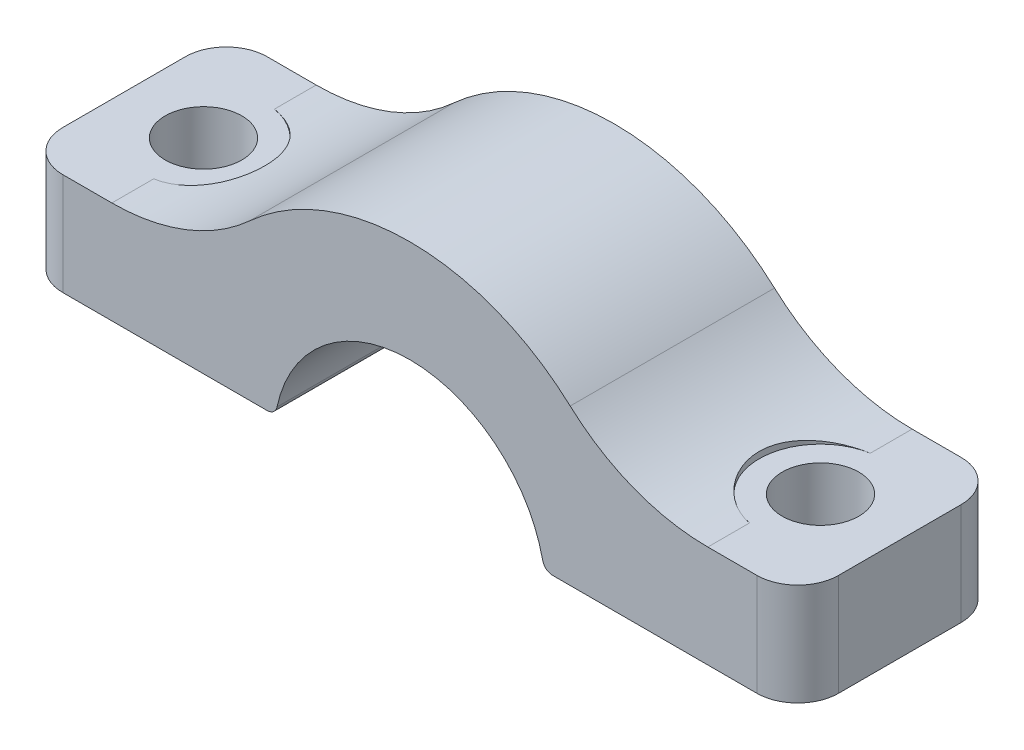
ISO-10303-21;
HEADER;
FILE_DESCRIPTION(('STEP AP214'),'2;1');
FILE_NAME('part.step','',(''),(''),'','','');
FILE_SCHEMA(('AUTOMOTIVE_DESIGN { 1 0 10303 214 1 1 1 1 }'));
ENDSEC;
DATA;
#1=APPLICATION_CONTEXT('core data for automotive mechanical design processes');
#2=APPLICATION_PROTOCOL_DEFINITION('international standard','automotive_design',2000,#1);
#3=PRODUCT_CONTEXT('',#1,'mechanical');
#4=PRODUCT('Part','Part','',(#3));
#5=PRODUCT_RELATED_PRODUCT_CATEGORY('part','',(#4));
#6=PRODUCT_DEFINITION_FORMATION('','',#4);
#7=PRODUCT_DEFINITION_CONTEXT('part definition',#1,'design');
#8=PRODUCT_DEFINITION('design','',#6,#7);
#9=PRODUCT_DEFINITION_SHAPE('','',#8);
#10=(LENGTH_UNIT() NAMED_UNIT(*) SI_UNIT(.MILLI.,.METRE.));
#11=(NAMED_UNIT(*) PLANE_ANGLE_UNIT() SI_UNIT($,.RADIAN.));
#12=(NAMED_UNIT(*) SI_UNIT($,.STERADIAN.) SOLID_ANGLE_UNIT());
#13=UNCERTAINTY_MEASURE_WITH_UNIT(LENGTH_MEASURE(1.E-05),#10,'distance_accuracy_value','');
#14=(GEOMETRIC_REPRESENTATION_CONTEXT(3) GLOBAL_UNCERTAINTY_ASSIGNED_CONTEXT((#13)) GLOBAL_UNIT_ASSIGNED_CONTEXT((#10,
#11,#12)) REPRESENTATION_CONTEXT('',''));
#15=CARTESIAN_POINT('',(0.,0.,0.));
#16=DIRECTION('',(0.,0.,1.));
#17=DIRECTION('',(1.,0.,0.));
#18=AXIS2_PLACEMENT_3D('',#15,#16,#17);
#19=CARTESIAN_POINT('',(14.585009427491,16.,10.));
#20=DIRECTION('',(0.,0.,-1.));
#21=DIRECTION('',(-1.,0.,0.));
#22=AXIS2_PLACEMENT_3D('',#19,#20,#21);
#23=CYLINDRICAL_SURFACE('',#22,10.);
#24=CARTESIAN_POINT('',(15.1,6.01326956856115,2.));
#25=CARTESIAN_POINT('',(14.9367661269146,6.00485250927544,2.00000087654459));
#26=CARTESIAN_POINT('',(14.7733130198023,6.00047314089498,2.01336498374644));
#27=CARTESIAN_POINT('',(14.4507340623399,5.99959983526748,2.06654076836193));
#28=CARTESIAN_POINT('',(14.2916088451906,6.0031070456679,2.10635629436694));
#29=CARTESIAN_POINT('',(13.9824039622912,6.01697370667861,2.21116419828854));
#30=CARTESIAN_POINT('',(13.8323151209738,6.02732607414875,2.27613052222466));
#31=CARTESIAN_POINT('',(13.5449995272484,6.05318066823682,2.42930175150398));
#32=CARTESIAN_POINT('',(13.4077745884691,6.06868361961851,2.51750992695973));
#33=CARTESIAN_POINT('',(13.1471274756397,6.10302418485625,2.71664587051002));
#34=CARTESIAN_POINT('',(13.0240242341483,6.12192058685345,2.82798070914123));
#35=CARTESIAN_POINT('',(12.7978456634663,6.16032349186018,3.06934006760822));
#36=CARTESIAN_POINT('',(12.6947734102481,6.17983008803845,3.19936745255918));
#37=CARTESIAN_POINT('',(12.5089912368211,6.21739371442309,3.4783367193665));
#38=CARTESIAN_POINT('',(12.4268659945818,6.23540124765545,3.62767561032553));
#39=CARTESIAN_POINT('',(12.2889318432733,6.26690875682487,3.938494763909));
#40=CARTESIAN_POINT('',(12.2331195892255,6.28040930563832,4.09997348025818));
#41=CARTESIAN_POINT('',(12.1502306670392,6.30084193053895,4.42809180125496));
#42=CARTESIAN_POINT('',(12.1227543096182,6.30786521684924,4.59462451830534));
#43=CARTESIAN_POINT('',(12.0961013815823,6.31467407950614,4.93007267217022));
#44=CARTESIAN_POINT('',(12.0969198300451,6.31446092973069,5.09898768438028));
#45=CARTESIAN_POINT('',(12.1264208127996,6.30693293318789,5.42974810288126));
#46=CARTESIAN_POINT('',(12.1543784564872,6.29980284177822,5.59166314029092));
#47=CARTESIAN_POINT('',(12.2361709364483,6.27967523634557,5.90843140509762));
#48=CARTESIAN_POINT('',(12.2900078653457,6.26667724784396,6.06328406031478));
#49=CARTESIAN_POINT('',(12.4225473808099,6.23637380885285,6.36322629164774));
#50=CARTESIAN_POINT('',(12.5014774622686,6.21902926973003,6.50821120050457));
#51=CARTESIAN_POINT('',(12.6818575561403,6.1823393498464,6.78315211368967));
#52=CARTESIAN_POINT('',(12.7833117431742,6.16299359853608,6.9131053252411));
#53=CARTESIAN_POINT('',(13.0093048544914,6.12423991542917,7.15813437709802));
#54=CARTESIAN_POINT('',(13.1344143619797,6.1048456309043,7.27268698098064));
#55=CARTESIAN_POINT('',(13.4024260023923,6.06925285003561,7.47928750170722));
#56=CARTESIAN_POINT('',(13.545327768877,6.05305428789221,7.57133588192012));
#57=CARTESIAN_POINT('',(13.8445651977366,6.02632443038393,7.72991857478263));
#58=CARTESIAN_POINT('',(14.0008556092624,6.01577485602301,7.79653497689334));
#59=CARTESIAN_POINT('',(14.3227201658627,6.00214481829379,7.9025028486271));
#60=CARTESIAN_POINT('',(14.4882918959838,5.99906242114751,7.94186137534753));
#61=CARTESIAN_POINT('',(14.8180866107259,6.00140167737486,7.99122142771891));
#62=CARTESIAN_POINT('',(14.982173315723,6.00654563770945,8.00215021431764));
#63=CARTESIAN_POINT('',(15.3094653969658,6.02492990765717,7.99714994043213));
#64=CARTESIAN_POINT('',(15.4726708259121,6.03816972760323,7.98122250420763));
#65=CARTESIAN_POINT('',(15.7919054823002,6.07181188718119,7.92357892272608));
#66=CARTESIAN_POINT('',(15.9479913422934,6.0921389855716,7.88213031106569));
#67=CARTESIAN_POINT('',(16.2507698081613,6.1385231368307,7.77516178570986));
#68=CARTESIAN_POINT('',(16.3974607704527,6.16458118878035,7.70963767357888));
#69=CARTESIAN_POINT('',(16.6828374846286,6.22139984005256,7.55381294499273));
#70=CARTESIAN_POINT('',(16.821072897982,6.25229159110764,7.46273602117571));
#71=CARTESIAN_POINT('',(17.080570692444,6.31547417342827,7.2593222946712));
#72=CARTESIAN_POINT('',(17.2018279624693,6.34776542218256,7.14697911384667));
#73=CARTESIAN_POINT('',(17.4287547501869,6.41211338496221,6.89900362869404));
#74=CARTESIAN_POINT('',(17.5336457534418,6.44411335275764,6.76264200580975));
#75=CARTESIAN_POINT('',(17.7189825282921,6.50327888460009,6.47324233219243));
#76=CARTESIAN_POINT('',(17.7994307320783,6.53044492953706,6.32020594274911));
#77=CARTESIAN_POINT('',(17.9320744834349,6.5765167494182,6.00411293437004));
#78=CARTESIAN_POINT('',(17.9847070825921,6.59554934692606,5.84125908140043));
#79=CARTESIAN_POINT('',(18.0615753114739,6.62368922808501,5.50817865340546));
#80=CARTESIAN_POINT('',(18.0858249055792,6.63280139241476,5.33795574672504));
#81=CARTESIAN_POINT('',(18.1043375617697,6.639743207317,5.00563008947493));
#82=CARTESIAN_POINT('',(18.1002630949471,6.63819840710948,4.84363107092403));
#83=CARTESIAN_POINT('',(18.0661907231786,6.62547597106318,4.52278480955927));
#84=CARTESIAN_POINT('',(18.0361940634744,6.61429879794122,4.36393741572367));
#85=CARTESIAN_POINT('',(17.9521326792553,6.58382153312819,4.05641710712524));
#86=CARTESIAN_POINT('',(17.8984672030347,6.56465646530946,3.90762075845107));
#87=CARTESIAN_POINT('',(17.7689319616492,6.52016314650259,3.62103418664591));
#88=CARTESIAN_POINT('',(17.6930572438296,6.4948335210324,3.48324642716091));
#89=CARTESIAN_POINT('',(17.5170084823166,6.43902238325403,3.21534490532022));
#90=CARTESIAN_POINT('',(17.4158329626556,6.40835035785096,3.08592922702766));
#91=CARTESIAN_POINT('',(17.1939506514231,6.34563812404769,2.84543359495513));
#92=CARTESIAN_POINT('',(17.0732371995063,6.31359745183669,2.73435992001505));
#93=CARTESIAN_POINT('',(16.8091253587159,6.24948273747569,2.5285246961349));
#94=CARTESIAN_POINT('',(16.6649371011506,6.21747541070739,2.43475265038361));
#95=CARTESIAN_POINT('',(16.3619576380787,6.15793520622467,2.27292591679266));
#96=CARTESIAN_POINT('',(16.2031713510765,6.13040083003093,2.20486260612389));
#97=CARTESIAN_POINT('',(15.8887167939138,6.0841787669958,2.10119708225808));
#98=CARTESIAN_POINT('',(15.7338495720015,6.06495287552263,2.06340094358118));
#99=CARTESIAN_POINT('',(15.4193907655109,6.033619221808,2.01280526636627));
#100=CARTESIAN_POINT('',(15.2598004369312,6.02150958471777,1.99999914189252));
#101=CARTESIAN_POINT('',(15.1,6.01326956856115,2.));
#102=B_SPLINE_CURVE_WITH_KNOTS('',3,(#24,#25,#26,#27,#28,#29,#30,#31,#32,#33,#34,#35,#36,#37,
#38,#39,#40,#41,#42,#43,#44,#45,#46,#47,#48,#49,#50,#51,#52,#53,#54,#55,#56,#57,#58,#59,#60,#61,
#62,#63,#64,#65,#66,#67,#68,#69,#70,#71,#72,#73,#74,#75,#76,#77,#78,#79,#80,#81,#82,#83,#84,#85,
#86,#87,#88,#89,#90,#91,#92,#93,#94,#95,#96,#97,#98,#99,#100,#101),.UNSPECIFIED.,.T.,.F.,(4,2,2,
2,2,2,2,2,2,2,2,2,2,2,2,2,2,2,2,2,2,2,2,2,2,2,2,2,2,2,2,2,2,2,2,2,2,2,4),(0.,0.48977623754343,
0.979623751472693,1.46896517911544,1.95837549355997,2.45726790341088,2.95623686309255,
3.46789866781725,3.97949541115228,4.48377286280824,4.98796154361287,5.47904364752406,
5.9701654674884,6.46587325675277,6.9616729973822,7.4714621168097,7.98124073863693,
8.48935969495784,8.99734704942886,9.48854535577046,9.97971395558851,10.4658193785395,
10.952009611842,11.454961600505,11.958064673294,12.4805100055567,13.0029033346437,
13.5168242895199,14.0304922899069,14.5142762695396,14.998037010609,15.4739323657771,
15.9499339264329,16.4490619008722,16.9483603843305,17.4707039618129,17.9928721869344,
18.4724729588657,18.9519473184372),.UNSPECIFIED.);
#103=CARTESIAN_POINT('',(14.585009427491,6.,2.04453308084377));
#104=VERTEX_POINT('',#103);
#105=CARTESIAN_POINT('',(14.585009427491,6.,7.95546691915623));
#106=VERTEX_POINT('',#105);
#107=EDGE_CURVE('E163',#104,#106,#102,.T.);
#108=ORIENTED_EDGE('',*,*,#107,.F.);
#109=DIRECTION('',(0.,0.,1.));
#110=VECTOR('',#109,1.);
#111=CARTESIAN_POINT('',(14.585009427491,6.,10.));
#112=LINE('',#111,#110);
#113=CARTESIAN_POINT('',(14.585009427491,6.,0.));
#114=VERTEX_POINT('',#113);
#115=EDGE_CURVE('E171',#114,#104,#112,.T.);
#116=ORIENTED_EDGE('',*,*,#115,.F.);
#117=CARTESIAN_POINT('',(14.585009427491,16.,0.));
#118=DIRECTION('',(0.,0.,-1.));
#119=DIRECTION('',(-1.,0.,0.));
#120=AXIS2_PLACEMENT_3D('',#117,#118,#119);
#121=CIRCLE('',#120,10.);
#122=CARTESIAN_POINT('',(7.84828451871916,8.60969976905312,0.));
#123=VERTEX_POINT('',#122);
#124=EDGE_CURVE('E189',#123,#114,#121,.F.);
#125=ORIENTED_EDGE('',*,*,#124,.F.);
#126=DIRECTION('',(0.,0.,-1.));
#127=VECTOR('',#126,1.);
#128=CARTESIAN_POINT('',(7.84828451871916,8.60969976905312,10.));
#129=LINE('',#128,#127);
#130=CARTESIAN_POINT('',(7.84828451871916,8.60969976905312,10.));
#131=VERTEX_POINT('',#130);
#132=EDGE_CURVE('E184',#131,#123,#129,.T.);
#133=ORIENTED_EDGE('',*,*,#132,.F.);
#134=CARTESIAN_POINT('',(14.585009427491,16.,10.));
#135=DIRECTION('',(0.,0.,-1.));
#136=DIRECTION('',(-1.,0.,0.));
#137=AXIS2_PLACEMENT_3D('',#134,#135,#136);
#138=CIRCLE('',#137,10.);
#139=CARTESIAN_POINT('',(14.585009427491,6.,10.));
#140=VERTEX_POINT('',#139);
#141=EDGE_CURVE('E191',#140,#131,#138,.T.);
#142=ORIENTED_EDGE('',*,*,#141,.F.);
#143=EDGE_CURVE('E173',#106,#140,#112,.T.);
#144=ORIENTED_EDGE('',*,*,#143,.F.);
#145=EDGE_LOOP('',(#108,#116,#125,#133,#142,#144));
#146=FACE_BOUND('',#145,.T.);
#147=ADVANCED_FACE('F35',(#146),#23,.F.);
#148=CARTESIAN_POINT('',(-14.585009427491,16.,10.));
#149=DIRECTION('',(0.,0.,-1.));
#150=DIRECTION('',(-1.,0.,0.));
#151=AXIS2_PLACEMENT_3D('',#148,#149,#150);
#152=CYLINDRICAL_SURFACE('',#151,10.);
#153=CARTESIAN_POINT('',(-15.1,6.01326956856115,2.));
#154=CARTESIAN_POINT('',(-15.2662117755336,6.02184297378347,2.00000303085017));
#155=CARTESIAN_POINT('',(-15.4322372306356,6.03460352897349,2.01386030403873));
#156=CARTESIAN_POINT('',(-15.7590112232876,6.06779282255189,2.06858728578722));
#157=CARTESIAN_POINT('',(-15.9197573289676,6.08822504238649,2.10946926473251));
#158=CARTESIAN_POINT('',(-16.2312392360417,6.13517838714395,2.21658920572691));
#159=CARTESIAN_POINT('',(-16.3819933226383,6.16168797043914,2.28277926189468));
#160=CARTESIAN_POINT('',(-16.6701126642558,6.21869430882438,2.43844328085547));
#161=CARTESIAN_POINT('',(-16.8074762483337,6.24919156040947,2.52792014440932));
#162=CARTESIAN_POINT('',(-17.069782065759,6.31265225920098,2.73100418970877));
#163=CARTESIAN_POINT('',(-17.1941861814981,6.34566339485298,2.8452918948355));
#164=CARTESIAN_POINT('',(-17.4222920128435,6.41021852518251,3.09333883351822));
#165=CARTESIAN_POINT('',(-17.5259899792645,6.44176225337041,3.22710158578046));
#166=CARTESIAN_POINT('',(-17.711393326165,6.50076959543992,3.51333135765307));
#167=CARTESIAN_POINT('',(-17.7926920417388,6.52815416125249,3.66607925567389));
#168=CARTESIAN_POINT('',(-17.9281116471196,6.57509431667898,3.98429808258634));
#169=CARTESIAN_POINT('',(-17.9822433835789,6.59465303019904,4.14976390326012));
#170=CARTESIAN_POINT('',(-18.0593899866755,6.62288397558402,4.48079064214418));
#171=CARTESIAN_POINT('',(-18.0836970349168,6.63200702796304,4.64601133303777));
#172=CARTESIAN_POINT('',(-18.1045369979876,6.63981485172712,4.97841819510255));
#173=CARTESIAN_POINT('',(-18.1010785819284,6.63850288120311,5.14560373651742));
#174=CARTESIAN_POINT('',(-18.0673878878902,6.62592307568733,5.46878087651226));
#175=CARTESIAN_POINT('',(-18.0384345423697,6.61513087042771,5.62492708373141));
#176=CARTESIAN_POINT('',(-17.9565841271422,6.58541760606264,5.92998726185955));
#177=CARTESIAN_POINT('',(-17.9036841353655,6.56649555493383,6.07890034769665));
#178=CARTESIAN_POINT('',(-17.774410290164,6.52200124908087,6.36864767441464));
#179=CARTESIAN_POINT('',(-17.6975949693576,6.49630544964481,6.50926525569681));
#180=CARTESIAN_POINT('',(-17.523066380775,6.44091077179691,6.77599875459484));
#181=CARTESIAN_POINT('',(-17.4253468630766,6.41121069717375,6.90211031783371));
#182=CARTESIAN_POINT('',(-17.2051826617232,6.34865256873632,7.14393614400381));
#183=CARTESIAN_POINT('',(-17.0816339263894,6.31571123602296,7.25862551285334));
#184=CARTESIAN_POINT('',(-16.8168485835212,6.25128509860817,7.46590908068989));
#185=CARTESIAN_POINT('',(-16.675609142876,6.21980052831109,7.5584997337209));
#186=CARTESIAN_POINT('',(-16.3760180768495,6.16048684123422,7.72053732380696));
#187=CARTESIAN_POINT('',(-16.2173888977767,6.13273996013065,7.78950332989075));
#188=CARTESIAN_POINT('',(-15.8896962714075,6.0840944313027,7.89934771141231));
#189=CARTESIAN_POINT('',(-15.720635804177,6.06319383836053,7.94023406867345));
#190=CARTESIAN_POINT('',(-15.3835242902923,6.03054739548138,7.99125272981063));
#191=CARTESIAN_POINT('',(-15.2156671119116,6.01849158314366,8.00246641291147));
#192=CARTESIAN_POINT('',(-14.880060715222,6.00294333058041,7.99662746200786));
#193=CARTESIAN_POINT('',(-14.7123114815765,5.99944907707822,7.97958081462093));
#194=CARTESIAN_POINT('',(-14.3877968794576,6.00067236049115,7.91874700227328));
#195=CARTESIAN_POINT('',(-14.2308522412091,6.0051106147661,7.87590314744753));
#196=CARTESIAN_POINT('',(-13.9262244045266,6.02055715389591,7.76559170491014));
#197=CARTESIAN_POINT('',(-13.7785417899463,6.03156585247534,7.69812256670946));
#198=CARTESIAN_POINT('',(-13.494704857303,6.05858084938915,7.53963633469887));
#199=CARTESIAN_POINT('',(-13.358700740291,6.07464255758443,7.44836017496975));
#200=CARTESIAN_POINT('',(-13.1035142153656,6.10951029780351,7.24514203200568));
#201=CARTESIAN_POINT('',(-12.9843352921737,6.12831689669508,7.13319577876719));
#202=CARTESIAN_POINT('',(-12.762102426751,6.16688401249111,6.8874772595428));
#203=CARTESIAN_POINT('',(-12.6597122533359,6.18665550594072,6.75310552721153));
#204=CARTESIAN_POINT('',(-12.478775057253,6.22388933527457,6.4688642577065));
#205=CARTESIAN_POINT('',(-12.4002286114356,6.24135161528634,6.31899434570352));
#206=CARTESIAN_POINT('',(-12.2690218590147,6.27165055884151,6.007120451703));
#207=CARTESIAN_POINT('',(-12.2164693890455,6.28446789495398,5.845069081899));
#208=CARTESIAN_POINT('',(-12.1394928398688,6.30355490567491,5.51405656950582));
#209=CARTESIAN_POINT('',(-12.1150623616787,6.30982606979343,5.34509700789675));
#210=CARTESIAN_POINT('',(-12.0954609235563,6.31484415232432,5.01013678613821));
#211=CARTESIAN_POINT('',(-12.0994903189131,6.31379671258588,4.84418563190882));
#212=CARTESIAN_POINT('',(-12.1347844632265,6.30480936314205,4.5154061974522));
#213=CARTESIAN_POINT('',(-12.1660484945116,6.29686963505828,4.35257783505052));
#214=CARTESIAN_POINT('',(-12.2543718297057,6.27528142544121,4.03606846223737));
#215=CARTESIAN_POINT('',(-12.3111996979454,6.26168424337315,3.88231908483438));
#216=CARTESIAN_POINT('',(-12.4488841057193,6.23056158402598,3.58641408215565));
#217=CARTESIAN_POINT('',(-12.5297444434709,6.21303548590808,3.44426029403696));
#218=CARTESIAN_POINT('',(-12.7157219725498,6.17579696071504,3.1715684547558));
#219=CARTESIAN_POINT('',(-12.8214181025323,6.15603935120017,3.04143128322698));
#220=CARTESIAN_POINT('',(-13.0530663222339,6.1173427731951,2.80045435932677));
#221=CARTESIAN_POINT('',(-13.1790220460374,6.09840395235066,2.68961807651361));
#222=CARTESIAN_POINT('',(-13.449995771387,6.06366981640971,2.4887543384881));
#223=CARTESIAN_POINT('',(-13.5952741472754,6.04792659196141,2.39906835429192));
#224=CARTESIAN_POINT('',(-13.8993137115169,6.02237368440044,2.24549093731877));
#225=CARTESIAN_POINT('',(-14.0580672404324,6.01256065591203,2.18158496815157));
#226=CARTESIAN_POINT('',(-14.3633050206921,6.00144519702215,2.08806068055245));
#227=CARTESIAN_POINT('',(-14.508735508212,5.99920930758507,2.05508601878494));
#228=CARTESIAN_POINT('',(-14.8028271040509,6.0012915645326,2.01105528650691));
#229=CARTESIAN_POINT('',(-14.9514879276157,6.00560913552101,1.99999729190163));
#230=CARTESIAN_POINT('',(-15.1,6.01326956856115,2.));
#231=B_SPLINE_CURVE_WITH_KNOTS('',3,(#153,#154,#155,#156,#157,#158,#159,#160,#161,#162,#163,
#164,#165,#166,#167,#168,#169,#170,#171,#172,#173,#174,#175,#176,#177,#178,#179,#180,#181,#182,
#183,#184,#185,#186,#187,#188,#189,#190,#191,#192,#193,#194,#195,#196,#197,#198,#199,#200,#201,
#202,#203,#204,#205,#206,#207,#208,#209,#210,#211,#212,#213,#214,#215,#216,#217,#218,#219,#220,
#221,#222,#223,#224,#225,#226,#227,#228,#229,#230),.UNSPECIFIED.,.T.,.F.,(4,2,2,2,2,2,2,2,2,2,2,
2,2,2,2,2,2,2,2,2,2,2,2,2,2,2,2,2,2,2,2,2,2,2,2,2,2,2,4),(0.,0.498742191202038,
0.997710988615097,1.49573992244734,1.99383092382011,2.50786022848459,3.02198252228831,
3.54490172959563,4.06761199044155,4.56676962971154,5.0657714248464,5.54108221633761,
6.01645102287552,6.50117486704356,6.98604383666207,7.49898890581833,8.01201622679666,
8.53494052320964,9.05771611338711,9.56115932540483,10.0644959025461,10.5504588486064,
11.0364523977761,11.5279727503151,12.0195947543803,12.527478356509,13.0353742448649,
13.5453598400901,14.0552293683429,14.5508311105461,15.0464197933335,15.5376093724876,
16.0288766231343,16.5329884532552,17.037190809978,17.5490480585355,18.0606162850783,
18.5062871147389,18.9519188166029),.UNSPECIFIED.);
#232=CARTESIAN_POINT('',(-14.585009427491,6.,7.95546691915623));
#233=VERTEX_POINT('',#232);
#234=CARTESIAN_POINT('',(-14.585009427491,6.,2.04453308084377));
#235=VERTEX_POINT('',#234);
#236=EDGE_CURVE('E175',#233,#235,#231,.T.);
#237=ORIENTED_EDGE('',*,*,#236,.F.);
#238=DIRECTION('',(0.,0.,1.));
#239=VECTOR('',#238,1.);
#240=CARTESIAN_POINT('',(-14.585009427491,6.,0.));
#241=LINE('',#240,#239);
#242=CARTESIAN_POINT('',(-14.585009427491,6.,10.));
#243=VERTEX_POINT('',#242);
#244=EDGE_CURVE('E182',#243,#233,#241,.F.);
#245=ORIENTED_EDGE('',*,*,#244,.F.);
#246=CARTESIAN_POINT('',(-14.585009427491,16.,10.));
#247=DIRECTION('',(0.,0.,-1.));
#248=DIRECTION('',(-1.,0.,0.));
#249=AXIS2_PLACEMENT_3D('',#246,#247,#248);
#250=CIRCLE('',#249,10.);
#251=CARTESIAN_POINT('',(-7.84828451871916,8.60969976905312,10.));
#252=VERTEX_POINT('',#251);
#253=EDGE_CURVE('E11',#252,#243,#250,.T.);
#254=ORIENTED_EDGE('',*,*,#253,.F.);
#255=DIRECTION('',(0.,0.,-1.));
#256=VECTOR('',#255,1.);
#257=CARTESIAN_POINT('',(-7.84828451871916,8.60969976905312,10.));
#258=LINE('',#257,#256);
#259=CARTESIAN_POINT('',(-7.84828451871916,8.60969976905312,0.));
#260=VERTEX_POINT('',#259);
#261=EDGE_CURVE('E207',#260,#252,#258,.F.);
#262=ORIENTED_EDGE('',*,*,#261,.F.);
#263=CARTESIAN_POINT('',(-14.585009427491,16.,0.));
#264=DIRECTION('',(0.,0.,-1.));
#265=DIRECTION('',(-1.,0.,0.));
#266=AXIS2_PLACEMENT_3D('',#263,#264,#265);
#267=CIRCLE('',#266,10.);
#268=CARTESIAN_POINT('',(-14.585009427491,6.,0.));
#269=VERTEX_POINT('',#268);
#270=EDGE_CURVE('E44',#269,#260,#267,.F.);
#271=ORIENTED_EDGE('',*,*,#270,.F.);
#272=EDGE_CURVE('E57',#235,#269,#241,.F.);
#273=ORIENTED_EDGE('',*,*,#272,.F.);
#274=EDGE_LOOP('',(#237,#245,#254,#262,#271,#273));
#275=FACE_BOUND('',#274,.T.);
#276=ADVANCED_FACE('F37',(#275),#152,.F.);
#277=CARTESIAN_POINT('',(-15.1,11.65,5.));
#278=DIRECTION('',(0.,-1.,0.));
#279=DIRECTION('',(0.,0.,-1.));
#280=AXIS2_PLACEMENT_3D('',#277,#278,#279);
#281=CYLINDRICAL_SURFACE('',#280,1.875);
#282=CARTESIAN_POINT('',(-15.1,1.,5.));
#283=DIRECTION('',(0.,1.,0.));
#284=DIRECTION('',(0.,0.,1.));
#285=AXIS2_PLACEMENT_3D('',#282,#283,#284);
#286=CIRCLE('',#285,1.875);
#287=CARTESIAN_POINT('',(-15.1,1.,6.875));
#288=VERTEX_POINT('',#287);
#289=EDGE_CURVE('E313',#288,#288,#286,.F.);
#290=ORIENTED_EDGE('',*,*,#289,.T.);
#291=EDGE_LOOP('',(#290));
#292=FACE_BOUND('',#291,.T.);
#293=CARTESIAN_POINT('',(-15.1,6.,5.));
#294=DIRECTION('',(0.,-1.,0.));
#295=DIRECTION('',(1.,0.,0.));
#296=AXIS2_PLACEMENT_3D('',#293,#294,#295);
#297=CIRCLE('',#296,1.875);
#298=CARTESIAN_POINT('',(-13.225,6.,5.));
#299=VERTEX_POINT('',#298);
#300=EDGE_CURVE('E174',#299,#299,#297,.F.);
#301=ORIENTED_EDGE('',*,*,#300,.T.);
#302=EDGE_LOOP('',(#301));
#303=FACE_BOUND('',#302,.T.);
#304=ADVANCED_FACE('F334',(#292,#303),#281,.F.);
#305=CARTESIAN_POINT('',(-18.9861153608398,5.99999999999999,10.));
#306=DIRECTION('',(1.,0.,0.));
#307=DIRECTION('',(0.,0.,-1.));
#308=AXIS2_PLACEMENT_3D('',#305,#306,#307);
#309=PLANE('',#308);
#310=DIRECTION('',(0.,0.,-1.));
#311=VECTOR('',#310,1.);
#312=CARTESIAN_POINT('',(-18.9861153608398,5.99999999999999,10.));
#313=LINE('',#312,#311);
#314=CARTESIAN_POINT('',(-18.9861153608398,5.99999999999999,8.));
#315=VERTEX_POINT('',#314);
#316=CARTESIAN_POINT('',(-18.9861153608398,5.99999999999999,2.));
#317=VERTEX_POINT('',#316);
#318=EDGE_CURVE('E279',#315,#317,#313,.T.);
#319=ORIENTED_EDGE('',*,*,#318,.T.);
#320=DIRECTION('',(0.,-1.,0.));
#321=VECTOR('',#320,1.);
#322=CARTESIAN_POINT('',(-18.9861153608398,1.,2.));
#323=LINE('',#322,#321);
#324=CARTESIAN_POINT('',(-18.9861153608398,1.,2.));
#325=VERTEX_POINT('',#324);
#326=EDGE_CURVE('E246',#317,#325,#323,.T.);
#327=ORIENTED_EDGE('',*,*,#326,.T.);
#328=DIRECTION('',(0.,0.,-1.));
#329=VECTOR('',#328,1.);
#330=CARTESIAN_POINT('',(-18.9861153608398,1.,10.));
#331=LINE('',#330,#329);
#332=CARTESIAN_POINT('',(-18.9861153608398,1.,8.));
#333=VERTEX_POINT('',#332);
#334=EDGE_CURVE('E270',#333,#325,#331,.T.);
#335=ORIENTED_EDGE('',*,*,#334,.F.);
#336=DIRECTION('',(0.,-1.,0.));
#337=VECTOR('',#336,1.);
#338=CARTESIAN_POINT('',(-18.9861153608398,5.99999999999999,8.));
#339=LINE('',#338,#337);
#340=EDGE_CURVE('E249',#333,#315,#339,.F.);
#341=ORIENTED_EDGE('',*,*,#340,.T.);
#342=EDGE_LOOP('',(#319,#327,#335,#341));
#343=FACE_BOUND('',#342,.T.);
#344=ADVANCED_FACE('F337',(#343),#309,.F.);
#345=CARTESIAN_POINT('',(-18.9861153608398,1.,10.));
#346=DIRECTION('',(0.,1.,0.));
#347=DIRECTION('',(0.,0.,1.));
#348=AXIS2_PLACEMENT_3D('',#345,#346,#347);
#349=PLANE('',#348);
#350=ORIENTED_EDGE('',*,*,#289,.F.);
#351=EDGE_LOOP('',(#350));
#352=FACE_BOUND('',#351,.T.);
#353=DIRECTION('',(1.,0.,0.));
#354=VECTOR('',#353,1.);
#355=CARTESIAN_POINT('',(-18.9861153608398,1.,0.));
#356=LINE('',#355,#354);
#357=CARTESIAN_POINT('',(-16.9861153608398,1.,0.));
#358=VERTEX_POINT('',#357);
#359=CARTESIAN_POINT('',(-6.99088692513332,1.,0.));
#360=VERTEX_POINT('',#359);
#361=EDGE_CURVE('E291',#358,#360,#356,.T.);
#362=ORIENTED_EDGE('',*,*,#361,.T.);
#363=DIRECTION('',(0.,0.,-1.));
#364=VECTOR('',#363,1.);
#365=CARTESIAN_POINT('',(-6.99088692513332,1.,10.));
#366=LINE('',#365,#364);
#367=CARTESIAN_POINT('',(-6.99088692513332,1.,10.));
#368=VERTEX_POINT('',#367);
#369=EDGE_CURVE('E220',#360,#368,#366,.F.);
#370=ORIENTED_EDGE('',*,*,#369,.T.);
#371=DIRECTION('',(1.,0.,0.));
#372=VECTOR('',#371,1.);
#373=CARTESIAN_POINT('',(-18.9861153608398,1.,10.));
#374=LINE('',#373,#372);
#375=CARTESIAN_POINT('',(-16.9861153608398,1.,10.));
#376=VERTEX_POINT('',#375);
#377=EDGE_CURVE('E283',#376,#368,#374,.T.);
#378=ORIENTED_EDGE('',*,*,#377,.F.);
#379=CARTESIAN_POINT('',(-16.9861153608398,1.,8.));
#380=DIRECTION('',(0.,1.,0.));
#381=DIRECTION('',(0.,0.,1.));
#382=AXIS2_PLACEMENT_3D('',#379,#380,#381);
#383=CIRCLE('',#382,2.);
#384=EDGE_CURVE('E244',#376,#333,#383,.F.);
#385=ORIENTED_EDGE('',*,*,#384,.T.);
#386=ORIENTED_EDGE('',*,*,#334,.T.);
#387=CARTESIAN_POINT('',(-16.9861153608398,1.,2.));
#388=DIRECTION('',(0.,1.,0.));
#389=DIRECTION('',(0.,0.,1.));
#390=AXIS2_PLACEMENT_3D('',#387,#388,#389);
#391=CIRCLE('',#390,2.);
#392=EDGE_CURVE('E242',#325,#358,#391,.F.);
#393=ORIENTED_EDGE('',*,*,#392,.T.);
#394=EDGE_LOOP('',(#362,#370,#378,#385,#386,#393));
#395=FACE_BOUND('',#394,.T.);
#396=ADVANCED_FACE('F368',(#352,#395),#349,.F.);
#397=CARTESIAN_POINT('',(0.,0.,10.));
#398=DIRECTION('',(0.,0.,-1.));
#399=DIRECTION('',(-1.,0.,0.));
#400=AXIS2_PLACEMENT_3D('',#397,#398,#399);
#401=CYLINDRICAL_SURFACE('',#400,6.65);
#402=CARTESIAN_POINT('',(0.,0.,10.));
#403=DIRECTION('',(0.,0.,-1.));
#404=DIRECTION('',(-1.,0.,0.));
#405=AXIS2_PLACEMENT_3D('',#402,#403,#404);
#406=CIRCLE('',#405,6.65);
#407=CARTESIAN_POINT('',(-6.50201371358553,1.39510489510489,10.));
#408=VERTEX_POINT('',#407);
#409=CARTESIAN_POINT('',(6.50201371358553,1.39510489510489,10.));
#410=VERTEX_POINT('',#409);
#411=EDGE_CURVE('E303',#408,#410,#406,.T.);
#412=ORIENTED_EDGE('',*,*,#411,.F.);
#413=DIRECTION('',(0.,0.,-1.));
#414=VECTOR('',#413,1.);
#415=CARTESIAN_POINT('',(-6.50201371358553,1.39510489510489,10.));
#416=LINE('',#415,#414);
#417=CARTESIAN_POINT('',(-6.50201371358553,1.39510489510489,0.));
#418=VERTEX_POINT('',#417);
#419=EDGE_CURVE('E226',#408,#418,#416,.T.);
#420=ORIENTED_EDGE('',*,*,#419,.T.);
#421=CARTESIAN_POINT('',(0.,0.,0.));
#422=DIRECTION('',(0.,0.,-1.));
#423=DIRECTION('',(-1.,0.,0.));
#424=AXIS2_PLACEMENT_3D('',#421,#422,#423);
#425=CIRCLE('',#424,6.65);
#426=CARTESIAN_POINT('',(6.50201371358553,1.39510489510489,0.));
#427=VERTEX_POINT('',#426);
#428=EDGE_CURVE('E288',#418,#427,#425,.T.);
#429=ORIENTED_EDGE('',*,*,#428,.T.);
#430=DIRECTION('',(0.,0.,-1.));
#431=VECTOR('',#430,1.);
#432=CARTESIAN_POINT('',(6.50201371358553,1.39510489510489,10.));
#433=LINE('',#432,#431);
#434=EDGE_CURVE('E229',#427,#410,#433,.F.);
#435=ORIENTED_EDGE('',*,*,#434,.T.);
#436=EDGE_LOOP('',(#412,#420,#429,#435));
#437=FACE_BOUND('',#436,.T.);
#438=ADVANCED_FACE('F364',(#437),#401,.F.);
#439=CARTESIAN_POINT('',(6.57438210024334,1.,10.));
#440=DIRECTION('',(0.,1.,0.));
#441=DIRECTION('',(0.,0.,1.));
#442=AXIS2_PLACEMENT_3D('',#439,#440,#441);
#443=PLANE('',#442);
#444=CARTESIAN_POINT('',(15.1,1.,5.));
#445=DIRECTION('',(0.,1.,0.));
#446=DIRECTION('',(0.,0.,1.));
#447=AXIS2_PLACEMENT_3D('',#444,#445,#446);
#448=CIRCLE('',#447,1.875);
#449=CARTESIAN_POINT('',(15.1,1.,6.875));
#450=VERTEX_POINT('',#449);
#451=EDGE_CURVE('E294',#450,#450,#448,.F.);
#452=ORIENTED_EDGE('',*,*,#451,.F.);
#453=EDGE_LOOP('',(#452));
#454=FACE_BOUND('',#453,.T.);
#455=DIRECTION('',(1.,0.,0.));
#456=VECTOR('',#455,1.);
#457=CARTESIAN_POINT('',(6.57438210024334,1.,10.));
#458=LINE('',#457,#456);
#459=CARTESIAN_POINT('',(6.99088692513332,1.,10.));
#460=VERTEX_POINT('',#459);
#461=CARTESIAN_POINT('',(16.9861153608398,1.,10.));
#462=VERTEX_POINT('',#461);
#463=EDGE_CURVE('E301',#460,#462,#458,.T.);
#464=ORIENTED_EDGE('',*,*,#463,.F.);
#465=DIRECTION('',(0.,0.,-1.));
#466=VECTOR('',#465,1.);
#467=CARTESIAN_POINT('',(6.99088692513332,1.,10.));
#468=LINE('',#467,#466);
#469=CARTESIAN_POINT('',(6.99088692513332,1.,0.));
#470=VERTEX_POINT('',#469);
#471=EDGE_CURVE('E212',#460,#470,#468,.T.);
#472=ORIENTED_EDGE('',*,*,#471,.T.);
#473=DIRECTION('',(1.,0.,0.));
#474=VECTOR('',#473,1.);
#475=CARTESIAN_POINT('',(6.57438210024334,1.,0.));
#476=LINE('',#475,#474);
#477=CARTESIAN_POINT('',(16.9861153608398,1.,0.));
#478=VERTEX_POINT('',#477);
#479=EDGE_CURVE('E286',#470,#478,#476,.T.);
#480=ORIENTED_EDGE('',*,*,#479,.T.);
#481=CARTESIAN_POINT('',(16.9861153608398,1.,2.));
#482=DIRECTION('',(0.,1.,0.));
#483=DIRECTION('',(0.,0.,1.));
#484=AXIS2_PLACEMENT_3D('',#481,#482,#483);
#485=CIRCLE('',#484,2.);
#486=CARTESIAN_POINT('',(18.9861153608398,1.,2.));
#487=VERTEX_POINT('',#486);
#488=EDGE_CURVE('E251',#478,#487,#485,.F.);
#489=ORIENTED_EDGE('',*,*,#488,.T.);
#490=DIRECTION('',(0.,0.,-1.));
#491=VECTOR('',#490,1.);
#492=CARTESIAN_POINT('',(18.9861153608398,1.,10.));
#493=LINE('',#492,#491);
#494=CARTESIAN_POINT('',(18.9861153608398,1.,8.));
#495=VERTEX_POINT('',#494);
#496=EDGE_CURVE('E273',#495,#487,#493,.T.);
#497=ORIENTED_EDGE('',*,*,#496,.F.);
#498=CARTESIAN_POINT('',(16.9861153608398,1.,8.));
#499=DIRECTION('',(0.,1.,0.));
#500=DIRECTION('',(0.,0.,1.));
#501=AXIS2_PLACEMENT_3D('',#498,#499,#500);
#502=CIRCLE('',#501,2.);
#503=EDGE_CURVE('E253',#495,#462,#502,.F.);
#504=ORIENTED_EDGE('',*,*,#503,.T.);
#505=EDGE_LOOP('',(#464,#472,#480,#489,#497,#504));
#506=FACE_BOUND('',#505,.T.);
#507=ADVANCED_FACE('F360',(#454,#506),#443,.F.);
#508=CARTESIAN_POINT('',(18.9861153608398,1.,10.));
#509=DIRECTION('',(-1.,0.,0.));
#510=DIRECTION('',(0.,-1.,0.));
#511=AXIS2_PLACEMENT_3D('',#508,#509,#510);
#512=PLANE('',#511);
#513=ORIENTED_EDGE('',*,*,#496,.T.);
#514=DIRECTION('',(0.,1.,0.));
#515=VECTOR('',#514,1.);
#516=CARTESIAN_POINT('',(18.9861153608398,6.,2.));
#517=LINE('',#516,#515);
#518=CARTESIAN_POINT('',(18.9861153608398,6.,2.));
#519=VERTEX_POINT('',#518);
#520=EDGE_CURVE('E265',#487,#519,#517,.T.);
#521=ORIENTED_EDGE('',*,*,#520,.T.);
#522=DIRECTION('',(0.,0.,-1.));
#523=VECTOR('',#522,1.);
#524=CARTESIAN_POINT('',(18.9861153608398,6.,10.));
#525=LINE('',#524,#523);
#526=CARTESIAN_POINT('',(18.9861153608398,6.,8.));
#527=VERTEX_POINT('',#526);
#528=EDGE_CURVE('E276',#527,#519,#525,.T.);
#529=ORIENTED_EDGE('',*,*,#528,.F.);
#530=DIRECTION('',(0.,1.,0.));
#531=VECTOR('',#530,1.);
#532=CARTESIAN_POINT('',(18.9861153608398,1.,8.));
#533=LINE('',#532,#531);
#534=EDGE_CURVE('E268',#527,#495,#533,.F.);
#535=ORIENTED_EDGE('',*,*,#534,.T.);
#536=EDGE_LOOP('',(#513,#521,#529,#535));
#537=FACE_BOUND('',#536,.T.);
#538=ADVANCED_FACE('F356',(#537),#512,.F.);
#539=CARTESIAN_POINT('',(18.9861153608398,6.,10.));
#540=DIRECTION('',(0.,-1.,0.));
#541=DIRECTION('',(1.,0.,0.));
#542=AXIS2_PLACEMENT_3D('',#539,#540,#541);
#543=PLANE('',#542);
#544=CARTESIAN_POINT('',(15.1,6.,5.));
#545=DIRECTION('',(0.,-1.,0.));
#546=DIRECTION('',(1.,0.,0.));
#547=AXIS2_PLACEMENT_3D('',#544,#545,#546);
#548=CIRCLE('',#547,1.875);
#549=CARTESIAN_POINT('',(16.975,6.,5.));
#550=VERTEX_POINT('',#549);
#551=EDGE_CURVE('E310',#550,#550,#548,.F.);
#552=ORIENTED_EDGE('',*,*,#551,.F.);
#553=EDGE_LOOP('',(#552));
#554=FACE_BOUND('',#553,.T.);
#555=ORIENTED_EDGE('',*,*,#115,.T.);
#556=CARTESIAN_POINT('',(15.1,6.,5.));
#557=DIRECTION('',(0.,1.,0.));
#558=DIRECTION('',(0.,0.,-1.));
#559=AXIS2_PLACEMENT_3D('',#556,#557,#558);
#560=CIRCLE('',#559,3.);
#561=EDGE_CURVE('E160',#104,#106,#560,.T.);
#562=ORIENTED_EDGE('',*,*,#561,.T.);
#563=ORIENTED_EDGE('',*,*,#143,.T.);
#564=DIRECTION('',(-1.,0.,0.));
#565=VECTOR('',#564,1.);
#566=CARTESIAN_POINT('',(18.9861153608398,6.,10.));
#567=LINE('',#566,#565);
#568=CARTESIAN_POINT('',(16.9861153608398,6.,10.));
#569=VERTEX_POINT('',#568);
#570=EDGE_CURVE('E298',#569,#140,#567,.T.);
#571=ORIENTED_EDGE('',*,*,#570,.F.);
#572=CARTESIAN_POINT('',(16.9861153608398,6.,8.));
#573=DIRECTION('',(0.,-1.,0.));
#574=DIRECTION('',(1.,0.,0.));
#575=AXIS2_PLACEMENT_3D('',#572,#573,#574);
#576=CIRCLE('',#575,2.);
#577=EDGE_CURVE('E263',#569,#527,#576,.F.);
#578=ORIENTED_EDGE('',*,*,#577,.T.);
#579=ORIENTED_EDGE('',*,*,#528,.T.);
#580=CARTESIAN_POINT('',(16.9861153608398,6.,2.));
#581=DIRECTION('',(0.,-1.,0.));
#582=DIRECTION('',(1.,0.,0.));
#583=AXIS2_PLACEMENT_3D('',#580,#581,#582);
#584=CIRCLE('',#583,2.);
#585=CARTESIAN_POINT('',(16.9861153608398,6.,0.));
#586=VERTEX_POINT('',#585);
#587=EDGE_CURVE('E261',#519,#586,#584,.F.);
#588=ORIENTED_EDGE('',*,*,#587,.T.);
#589=DIRECTION('',(-1.,0.,0.));
#590=VECTOR('',#589,1.);
#591=CARTESIAN_POINT('',(18.9861153608398,6.,0.));
#592=LINE('',#591,#590);
#593=EDGE_CURVE('E180',#586,#114,#592,.T.);
#594=ORIENTED_EDGE('',*,*,#593,.T.);
#595=EDGE_LOOP('',(#555,#562,#563,#571,#578,#579,#588,#594));
#596=FACE_BOUND('',#595,.T.);
#597=ADVANCED_FACE('F178',(#554,#596),#543,.F.);
#598=CARTESIAN_POINT('',(0.,0.,10.));
#599=DIRECTION('',(0.,0.,-1.));
#600=DIRECTION('',(-1.,0.,0.));
#601=AXIS2_PLACEMENT_3D('',#598,#599,#600);
#602=CYLINDRICAL_SURFACE('',#601,11.65);
#603=CARTESIAN_POINT('',(0.,0.,10.));
#604=DIRECTION('',(0.,0.,1.));
#605=DIRECTION('',(-1.,0.,0.));
#606=AXIS2_PLACEMENT_3D('',#603,#604,#605);
#607=CIRCLE('',#606,11.65);
#608=EDGE_CURVE('E296',#131,#252,#607,.T.);
#609=ORIENTED_EDGE('',*,*,#608,.F.);
#610=ORIENTED_EDGE('',*,*,#132,.T.);
#611=CARTESIAN_POINT('',(0.,0.,0.));
#612=DIRECTION('',(0.,0.,1.));
#613=DIRECTION('',(-1.,0.,0.));
#614=AXIS2_PLACEMENT_3D('',#611,#612,#613);
#615=CIRCLE('',#614,11.65);
#616=EDGE_CURVE('E198',#123,#260,#615,.T.);
#617=ORIENTED_EDGE('',*,*,#616,.T.);
#618=ORIENTED_EDGE('',*,*,#261,.T.);
#619=EDGE_LOOP('',(#609,#610,#617,#618));
#620=FACE_BOUND('',#619,.T.);
#621=ADVANCED_FACE('F206',(#620),#602,.T.);
#622=CARTESIAN_POINT('',(-9.98611536083977,6.,10.));
#623=DIRECTION('',(0.,-1.,0.));
#624=DIRECTION('',(1.,0.,0.));
#625=AXIS2_PLACEMENT_3D('',#622,#623,#624);
#626=PLANE('',#625);
#627=CARTESIAN_POINT('',(-15.1,6.,5.));
#628=DIRECTION('',(0.,1.,0.));
#629=DIRECTION('',(0.,0.,1.));
#630=AXIS2_PLACEMENT_3D('',#627,#628,#629);
#631=CIRCLE('',#630,3.);
#632=EDGE_CURVE('E167',#233,#235,#631,.T.);
#633=ORIENTED_EDGE('',*,*,#632,.T.);
#634=ORIENTED_EDGE('',*,*,#272,.T.);
#635=DIRECTION('',(-1.,0.,0.));
#636=VECTOR('',#635,1.);
#637=CARTESIAN_POINT('',(-9.98611536083977,6.,0.));
#638=LINE('',#637,#636);
#639=CARTESIAN_POINT('',(-16.9861153608398,6.,0.));
#640=VERTEX_POINT('',#639);
#641=EDGE_CURVE('E200',#269,#640,#638,.T.);
#642=ORIENTED_EDGE('',*,*,#641,.T.);
#643=CARTESIAN_POINT('',(-16.9861153608398,6.,2.));
#644=DIRECTION('',(0.,-1.,0.));
#645=DIRECTION('',(1.,0.,0.));
#646=AXIS2_PLACEMENT_3D('',#643,#644,#645);
#647=CIRCLE('',#646,2.);
#648=EDGE_CURVE('E237',#640,#317,#647,.F.);
#649=ORIENTED_EDGE('',*,*,#648,.T.);
#650=ORIENTED_EDGE('',*,*,#318,.F.);
#651=CARTESIAN_POINT('',(-16.9861153608398,6.,8.));
#652=DIRECTION('',(0.,-1.,0.));
#653=DIRECTION('',(1.,0.,0.));
#654=AXIS2_PLACEMENT_3D('',#651,#652,#653);
#655=CIRCLE('',#654,2.);
#656=CARTESIAN_POINT('',(-16.9861153608398,6.,10.));
#657=VERTEX_POINT('',#656);
#658=EDGE_CURVE('E239',#315,#657,#655,.F.);
#659=ORIENTED_EDGE('',*,*,#658,.T.);
#660=DIRECTION('',(-1.,0.,0.));
#661=VECTOR('',#660,1.);
#662=CARTESIAN_POINT('',(-9.98611536083977,6.,10.));
#663=LINE('',#662,#661);
#664=EDGE_CURVE('E282',#243,#657,#663,.T.);
#665=ORIENTED_EDGE('',*,*,#664,.F.);
#666=ORIENTED_EDGE('',*,*,#244,.T.);
#667=EDGE_LOOP('',(#633,#634,#642,#649,#650,#659,#665,#666));
#668=FACE_BOUND('',#667,.T.);
#669=ORIENTED_EDGE('',*,*,#300,.F.);
#670=EDGE_LOOP('',(#669));
#671=FACE_BOUND('',#670,.T.);
#672=ADVANCED_FACE('F346',(#668,#671),#626,.F.);
#673=CARTESIAN_POINT('',(0.,0.,10.));
#674=DIRECTION('',(0.,0.,-1.));
#675=DIRECTION('',(-1.,0.,0.));
#676=AXIS2_PLACEMENT_3D('',#673,#674,#675);
#677=PLANE('',#676);
#678=ORIENTED_EDGE('',*,*,#377,.T.);
#679=CARTESIAN_POINT('',(-6.99088692513332,1.5,10.));
#680=DIRECTION('',(0.,0.,-1.));
#681=DIRECTION('',(-1.,0.,0.));
#682=AXIS2_PLACEMENT_3D('',#679,#680,#681);
#683=CIRCLE('',#682,0.5);
#684=EDGE_CURVE('E214',#368,#408,#683,.F.);
#685=ORIENTED_EDGE('',*,*,#684,.T.);
#686=ORIENTED_EDGE('',*,*,#411,.T.);
#687=CARTESIAN_POINT('',(6.99088692513332,1.5,10.));
#688=DIRECTION('',(0.,0.,-1.));
#689=DIRECTION('',(-1.,0.,0.));
#690=AXIS2_PLACEMENT_3D('',#687,#688,#689);
#691=CIRCLE('',#690,0.5);
#692=EDGE_CURVE('E218',#410,#460,#691,.F.);
#693=ORIENTED_EDGE('',*,*,#692,.T.);
#694=ORIENTED_EDGE('',*,*,#463,.T.);
#695=DIRECTION('',(0.,1.,0.));
#696=VECTOR('',#695,1.);
#697=CARTESIAN_POINT('',(16.9861153608398,0.,10.));
#698=LINE('',#697,#696);
#699=EDGE_CURVE('E231',#462,#569,#698,.T.);
#700=ORIENTED_EDGE('',*,*,#699,.T.);
#701=ORIENTED_EDGE('',*,*,#570,.T.);
#702=ORIENTED_EDGE('',*,*,#141,.T.);
#703=ORIENTED_EDGE('',*,*,#608,.T.);
#704=ORIENTED_EDGE('',*,*,#253,.T.);
#705=ORIENTED_EDGE('',*,*,#664,.T.);
#706=DIRECTION('',(0.,-1.,0.));
#707=VECTOR('',#706,1.);
#708=CARTESIAN_POINT('',(-16.9861153608398,0.,10.));
#709=LINE('',#708,#707);
#710=EDGE_CURVE('E234',#657,#376,#709,.T.);
#711=ORIENTED_EDGE('',*,*,#710,.T.);
#712=EDGE_LOOP('',(#678,#685,#686,#693,#694,#700,#701,#702,#703,#704,#705,#711));
#713=FACE_BOUND('',#712,.T.);
#714=ADVANCED_FACE('F343',(#713),#677,.F.);
#715=CARTESIAN_POINT('',(0.,0.,0.));
#716=DIRECTION('',(0.,0.,-1.));
#717=DIRECTION('',(-1.,0.,0.));
#718=AXIS2_PLACEMENT_3D('',#715,#716,#717);
#719=PLANE('',#718);
#720=ORIENTED_EDGE('',*,*,#428,.F.);
#721=CARTESIAN_POINT('',(-6.99088692513332,1.5,0.));
#722=DIRECTION('',(0.,0.,-1.));
#723=DIRECTION('',(-1.,0.,0.));
#724=AXIS2_PLACEMENT_3D('',#721,#722,#723);
#725=CIRCLE('',#724,0.5);
#726=EDGE_CURVE('E222',#418,#360,#725,.T.);
#727=ORIENTED_EDGE('',*,*,#726,.T.);
#728=ORIENTED_EDGE('',*,*,#361,.F.);
#729=DIRECTION('',(0.,-1.,0.));
#730=VECTOR('',#729,1.);
#731=CARTESIAN_POINT('',(-16.9861153608398,5.99999999999999,0.));
#732=LINE('',#731,#730);
#733=EDGE_CURVE('E259',#358,#640,#732,.F.);
#734=ORIENTED_EDGE('',*,*,#733,.T.);
#735=ORIENTED_EDGE('',*,*,#641,.F.);
#736=ORIENTED_EDGE('',*,*,#270,.T.);
#737=ORIENTED_EDGE('',*,*,#616,.F.);
#738=ORIENTED_EDGE('',*,*,#124,.T.);
#739=ORIENTED_EDGE('',*,*,#593,.F.);
#740=DIRECTION('',(0.,1.,0.));
#741=VECTOR('',#740,1.);
#742=CARTESIAN_POINT('',(16.9861153608398,1.,0.));
#743=LINE('',#742,#741);
#744=EDGE_CURVE('E256',#586,#478,#743,.F.);
#745=ORIENTED_EDGE('',*,*,#744,.T.);
#746=ORIENTED_EDGE('',*,*,#479,.F.);
#747=CARTESIAN_POINT('',(6.99088692513332,1.5,0.));
#748=DIRECTION('',(0.,0.,-1.));
#749=DIRECTION('',(-1.,0.,0.));
#750=AXIS2_PLACEMENT_3D('',#747,#748,#749);
#751=CIRCLE('',#750,0.5);
#752=EDGE_CURVE('E224',#470,#427,#751,.T.);
#753=ORIENTED_EDGE('',*,*,#752,.T.);
#754=EDGE_LOOP('',(#720,#727,#728,#734,#735,#736,#737,#738,#739,#745,#746,#753));
#755=FACE_BOUND('',#754,.T.);
#756=ADVANCED_FACE('F197',(#755),#719,.T.);
#757=CARTESIAN_POINT('',(16.9861153608398,1.,2.));
#758=DIRECTION('',(0.,-1.,0.));
#759=DIRECTION('',(1.,0.,0.));
#760=AXIS2_PLACEMENT_3D('',#757,#758,#759);
#761=CYLINDRICAL_SURFACE('',#760,2.);
#762=ORIENTED_EDGE('',*,*,#488,.F.);
#763=ORIENTED_EDGE('',*,*,#744,.F.);
#764=ORIENTED_EDGE('',*,*,#587,.F.);
#765=ORIENTED_EDGE('',*,*,#520,.F.);
#766=EDGE_LOOP('',(#762,#763,#764,#765));
#767=FACE_BOUND('',#766,.T.);
#768=ADVANCED_FACE('F349',(#767),#761,.T.);
#769=CARTESIAN_POINT('',(-16.9861153608398,5.99999999999999,2.));
#770=DIRECTION('',(0.,1.,0.));
#771=DIRECTION('',(0.,0.,1.));
#772=AXIS2_PLACEMENT_3D('',#769,#770,#771);
#773=CYLINDRICAL_SURFACE('',#772,2.);
#774=ORIENTED_EDGE('',*,*,#648,.F.);
#775=ORIENTED_EDGE('',*,*,#733,.F.);
#776=ORIENTED_EDGE('',*,*,#392,.F.);
#777=ORIENTED_EDGE('',*,*,#326,.F.);
#778=EDGE_LOOP('',(#774,#775,#776,#777));
#779=FACE_BOUND('',#778,.T.);
#780=ADVANCED_FACE('F378',(#779),#773,.T.);
#781=CARTESIAN_POINT('',(16.9861153608398,0.,8.));
#782=DIRECTION('',(0.,1.,0.));
#783=DIRECTION('',(-1.,0.,0.));
#784=AXIS2_PLACEMENT_3D('',#781,#782,#783);
#785=CYLINDRICAL_SURFACE('',#784,2.);
#786=ORIENTED_EDGE('',*,*,#503,.F.);
#787=ORIENTED_EDGE('',*,*,#534,.F.);
#788=ORIENTED_EDGE('',*,*,#577,.F.);
#789=ORIENTED_EDGE('',*,*,#699,.F.);
#790=EDGE_LOOP('',(#786,#787,#788,#789));
#791=FACE_BOUND('',#790,.T.);
#792=ADVANCED_FACE('F382',(#791),#785,.T.);
#793=CARTESIAN_POINT('',(-16.9861153608398,0.,8.));
#794=DIRECTION('',(0.,-1.,0.));
#795=DIRECTION('',(0.,0.,-1.));
#796=AXIS2_PLACEMENT_3D('',#793,#794,#795);
#797=CYLINDRICAL_SURFACE('',#796,2.);
#798=ORIENTED_EDGE('',*,*,#658,.F.);
#799=ORIENTED_EDGE('',*,*,#340,.F.);
#800=ORIENTED_EDGE('',*,*,#384,.F.);
#801=ORIENTED_EDGE('',*,*,#710,.F.);
#802=EDGE_LOOP('',(#798,#799,#800,#801));
#803=FACE_BOUND('',#802,.T.);
#804=ADVANCED_FACE('F386',(#803),#797,.T.);
#805=CARTESIAN_POINT('',(-6.99088692513332,1.5,10.));
#806=DIRECTION('',(0.,0.,-1.));
#807=DIRECTION('',(-1.,0.,0.));
#808=AXIS2_PLACEMENT_3D('',#805,#806,#807);
#809=CYLINDRICAL_SURFACE('',#808,0.5);
#810=ORIENTED_EDGE('',*,*,#684,.F.);
#811=ORIENTED_EDGE('',*,*,#369,.F.);
#812=ORIENTED_EDGE('',*,*,#726,.F.);
#813=ORIENTED_EDGE('',*,*,#419,.F.);
#814=EDGE_LOOP('',(#810,#811,#812,#813));
#815=FACE_BOUND('',#814,.T.);
#816=ADVANCED_FACE('F390',(#815),#809,.T.);
#817=CARTESIAN_POINT('',(6.99088692513332,1.5,10.));
#818=DIRECTION('',(0.,0.,-1.));
#819=DIRECTION('',(-1.,0.,0.));
#820=AXIS2_PLACEMENT_3D('',#817,#818,#819);
#821=CYLINDRICAL_SURFACE('',#820,0.5);
#822=ORIENTED_EDGE('',*,*,#692,.F.);
#823=ORIENTED_EDGE('',*,*,#434,.F.);
#824=ORIENTED_EDGE('',*,*,#752,.F.);
#825=ORIENTED_EDGE('',*,*,#471,.F.);
#826=EDGE_LOOP('',(#822,#823,#824,#825));
#827=FACE_BOUND('',#826,.T.);
#828=ADVANCED_FACE('F341',(#827),#821,.T.);
#829=CARTESIAN_POINT('',(15.1,11.65,5.));
#830=DIRECTION('',(0.,-1.,0.));
#831=DIRECTION('',(0.,0.,-1.));
#832=AXIS2_PLACEMENT_3D('',#829,#830,#831);
#833=CYLINDRICAL_SURFACE('',#832,1.875);
#834=ORIENTED_EDGE('',*,*,#551,.T.);
#835=EDGE_LOOP('',(#834));
#836=FACE_BOUND('',#835,.T.);
#837=ORIENTED_EDGE('',*,*,#451,.T.);
#838=EDGE_LOOP('',(#837));
#839=FACE_BOUND('',#838,.T.);
#840=ADVANCED_FACE('F332',(#836,#839),#833,.F.);
#841=CARTESIAN_POINT('',(15.1,16.,5.));
#842=DIRECTION('',(0.,-1.,0.));
#843=DIRECTION('',(0.,0.,-1.));
#844=AXIS2_PLACEMENT_3D('',#841,#842,#843);
#845=CYLINDRICAL_SURFACE('',#844,3.);
#846=ORIENTED_EDGE('',*,*,#107,.T.);
#847=ORIENTED_EDGE('',*,*,#561,.F.);
#848=EDGE_LOOP('',(#846,#847));
#849=FACE_BOUND('',#848,.T.);
#850=ADVANCED_FACE('F162',(#849),#845,.F.);
#851=CARTESIAN_POINT('',(-15.1,16.,5.));
#852=DIRECTION('',(0.,-1.,0.));
#853=DIRECTION('',(0.,0.,-1.));
#854=AXIS2_PLACEMENT_3D('',#851,#852,#853);
#855=CYLINDRICAL_SURFACE('',#854,3.);
#856=ORIENTED_EDGE('',*,*,#236,.T.);
#857=ORIENTED_EDGE('',*,*,#632,.F.);
#858=EDGE_LOOP('',(#856,#857));
#859=FACE_BOUND('',#858,.T.);
#860=ADVANCED_FACE('F331',(#859),#855,.F.);
#861=CLOSED_SHELL('',(#147,#276,#304,#344,#396,#438,#507,#538,#597,#621,#672,#714,#756,#768,
#780,#792,#804,#816,#828,#840,#850,#860));
#862=MANIFOLD_SOLID_BREP('B2',#861);
#863=ADVANCED_BREP_SHAPE_REPRESENTATION('',(#18,#862),#14);
#864=SHAPE_DEFINITION_REPRESENTATION(#9,#863);
ENDSEC;
END-ISO-10303-21;
